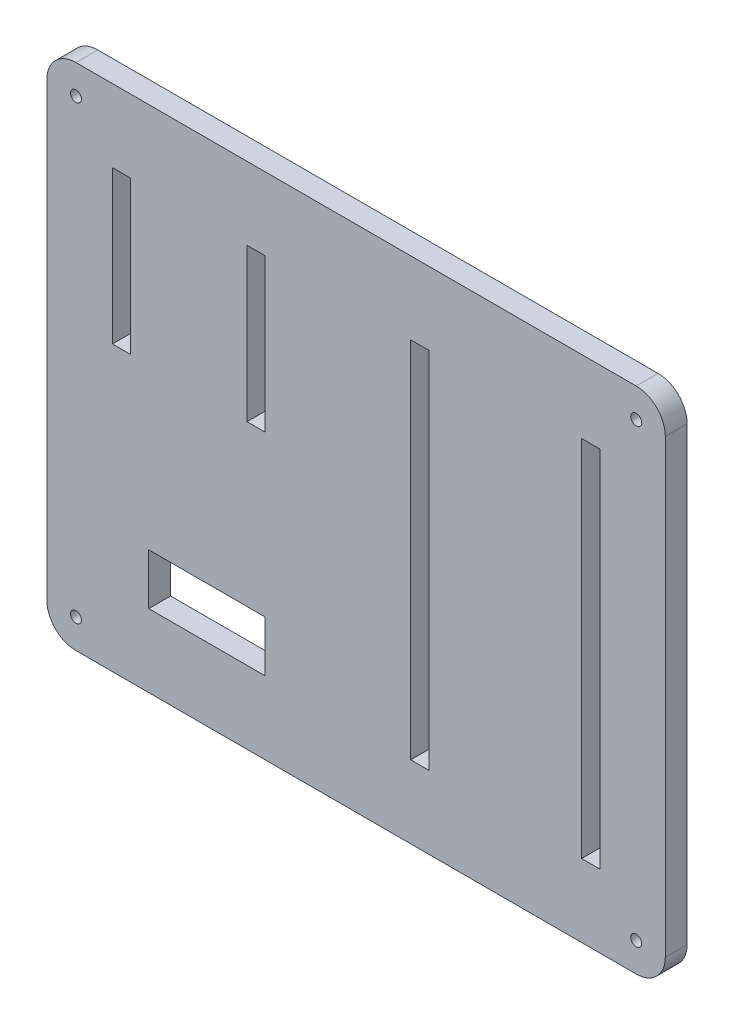
ISO-10303-21;
HEADER;
FILE_DESCRIPTION(('STEP AP214'),'2;1');
FILE_NAME('part.step','',(''),(''),'','','');
FILE_SCHEMA(('AUTOMOTIVE_DESIGN { 1 0 10303 214 1 1 1 1 }'));
ENDSEC;
DATA;
#1=APPLICATION_CONTEXT('core data for automotive mechanical design processes');
#2=APPLICATION_PROTOCOL_DEFINITION('international standard','automotive_design',2000,#1);
#3=PRODUCT_CONTEXT('',#1,'mechanical');
#4=PRODUCT('Part','Part','',(#3));
#5=PRODUCT_RELATED_PRODUCT_CATEGORY('part','',(#4));
#6=PRODUCT_DEFINITION_FORMATION('','',#4);
#7=PRODUCT_DEFINITION_CONTEXT('part definition',#1,'design');
#8=PRODUCT_DEFINITION('design','',#6,#7);
#9=PRODUCT_DEFINITION_SHAPE('','',#8);
#10=(LENGTH_UNIT() NAMED_UNIT(*) SI_UNIT(.MILLI.,.METRE.));
#11=(NAMED_UNIT(*) PLANE_ANGLE_UNIT() SI_UNIT($,.RADIAN.));
#12=(NAMED_UNIT(*) SI_UNIT($,.STERADIAN.) SOLID_ANGLE_UNIT());
#13=UNCERTAINTY_MEASURE_WITH_UNIT(LENGTH_MEASURE(1.E-05),#10,'distance_accuracy_value','');
#14=(GEOMETRIC_REPRESENTATION_CONTEXT(3) GLOBAL_UNCERTAINTY_ASSIGNED_CONTEXT((#13)) GLOBAL_UNIT_ASSIGNED_CONTEXT((#10,
#11,#12)) REPRESENTATION_CONTEXT('',''));
#15=CARTESIAN_POINT('',(0.,0.,0.));
#16=DIRECTION('',(0.,0.,1.));
#17=DIRECTION('',(1.,0.,0.));
#18=AXIS2_PLACEMENT_3D('',#15,#16,#17);
#19=CARTESIAN_POINT('',(0.,0.,3.));
#20=DIRECTION('',(0.,0.,1.));
#21=DIRECTION('',(1.,0.,0.));
#22=AXIS2_PLACEMENT_3D('',#19,#20,#21);
#23=PLANE('',#22);
#24=CARTESIAN_POINT('',(-38.5,31.,3.));
#25=DIRECTION('',(0.,0.,1.));
#26=DIRECTION('',(1.,0.,0.));
#27=AXIS2_PLACEMENT_3D('',#24,#25,#26);
#28=CIRCLE('',#27,0.75);
#29=CARTESIAN_POINT('',(-37.75,31.,3.));
#30=VERTEX_POINT('',#29);
#31=EDGE_CURVE('E766',#30,#30,#28,.F.);
#32=ORIENTED_EDGE('',*,*,#31,.T.);
#33=EDGE_LOOP('',(#32));
#34=FACE_BOUND('',#33,.T.);
#35=CARTESIAN_POINT('',(38.5,31.,3.));
#36=DIRECTION('',(0.,0.,1.));
#37=DIRECTION('',(1.,0.,0.));
#38=AXIS2_PLACEMENT_3D('',#35,#36,#37);
#39=CIRCLE('',#38,0.749999999999999);
#40=CARTESIAN_POINT('',(39.25,31.,3.));
#41=VERTEX_POINT('',#40);
#42=EDGE_CURVE('E763',#41,#41,#39,.T.);
#43=ORIENTED_EDGE('',*,*,#42,.F.);
#44=EDGE_LOOP('',(#43));
#45=FACE_BOUND('',#44,.T.);
#46=DIRECTION('',(0.,-1.,0.));
#47=VECTOR('',#46,1.);
#48=CARTESIAN_POINT('',(-12.5,0.,3.));
#49=LINE('',#48,#47);
#50=CARTESIAN_POINT('',(-12.5,-18.,3.));
#51=VERTEX_POINT('',#50);
#52=CARTESIAN_POINT('',(-12.5,-25.,3.));
#53=VERTEX_POINT('',#52);
#54=EDGE_CURVE('E301',#51,#53,#49,.T.);
#55=ORIENTED_EDGE('',*,*,#54,.T.);
#56=DIRECTION('',(-1.,0.,0.));
#57=VECTOR('',#56,1.);
#58=CARTESIAN_POINT('',(0.,-25.,3.));
#59=LINE('',#58,#57);
#60=CARTESIAN_POINT('',(-28.5,-25.,3.));
#61=VERTEX_POINT('',#60);
#62=EDGE_CURVE('E304',#53,#61,#59,.T.);
#63=ORIENTED_EDGE('',*,*,#62,.T.);
#64=DIRECTION('',(0.,-1.,0.));
#65=VECTOR('',#64,1.);
#66=CARTESIAN_POINT('',(-28.5,0.,3.));
#67=LINE('',#66,#65);
#68=CARTESIAN_POINT('',(-28.5,-18.,3.));
#69=VERTEX_POINT('',#68);
#70=EDGE_CURVE('E308',#69,#61,#67,.T.);
#71=ORIENTED_EDGE('',*,*,#70,.F.);
#72=DIRECTION('',(-1.,0.,0.));
#73=VECTOR('',#72,1.);
#74=CARTESIAN_POINT('',(0.,-18.,3.));
#75=LINE('',#74,#73);
#76=EDGE_CURVE('E311',#51,#69,#75,.T.);
#77=ORIENTED_EDGE('',*,*,#76,.F.);
#78=EDGE_LOOP('',(#55,#63,#71,#77));
#79=FACE_BOUND('',#78,.T.);
#80=DIRECTION('',(0.,1.,0.));
#81=VECTOR('',#80,1.);
#82=CARTESIAN_POINT('',(42.5,35.,3.));
#83=LINE('',#82,#81);
#84=CARTESIAN_POINT('',(42.5,-31.,3.));
#85=VERTEX_POINT('',#84);
#86=CARTESIAN_POINT('',(42.5,31.,3.));
#87=VERTEX_POINT('',#86);
#88=EDGE_CURVE('E392',#85,#87,#83,.T.);
#89=ORIENTED_EDGE('',*,*,#88,.T.);
#90=CARTESIAN_POINT('',(38.5,31.,3.));
#91=DIRECTION('',(0.,0.,1.));
#92=DIRECTION('',(1.,0.,0.));
#93=AXIS2_PLACEMENT_3D('',#90,#91,#92);
#94=CIRCLE('',#93,4.);
#95=CARTESIAN_POINT('',(38.5,35.,3.));
#96=VERTEX_POINT('',#95);
#97=EDGE_CURVE('E435',#87,#96,#94,.T.);
#98=ORIENTED_EDGE('',*,*,#97,.T.);
#99=DIRECTION('',(-1.,0.,0.));
#100=VECTOR('',#99,1.);
#101=CARTESIAN_POINT('',(-42.5,35.,3.));
#102=LINE('',#101,#100);
#103=CARTESIAN_POINT('',(-38.5,35.,3.));
#104=VERTEX_POINT('',#103);
#105=EDGE_CURVE('E395',#96,#104,#102,.T.);
#106=ORIENTED_EDGE('',*,*,#105,.T.);
#107=CARTESIAN_POINT('',(-38.5,31.,3.));
#108=DIRECTION('',(0.,0.,1.));
#109=DIRECTION('',(1.,0.,0.));
#110=AXIS2_PLACEMENT_3D('',#107,#108,#109);
#111=CIRCLE('',#110,4.);
#112=CARTESIAN_POINT('',(-42.5,31.,3.));
#113=VERTEX_POINT('',#112);
#114=EDGE_CURVE('E433',#104,#113,#111,.T.);
#115=ORIENTED_EDGE('',*,*,#114,.T.);
#116=DIRECTION('',(0.,-1.,0.));
#117=VECTOR('',#116,1.);
#118=CARTESIAN_POINT('',(-42.5,35.,3.));
#119=LINE('',#118,#117);
#120=CARTESIAN_POINT('',(-42.5,-31.,3.));
#121=VERTEX_POINT('',#120);
#122=EDGE_CURVE('E399',#113,#121,#119,.T.);
#123=ORIENTED_EDGE('',*,*,#122,.T.);
#124=CARTESIAN_POINT('',(-38.5,-31.,3.));
#125=DIRECTION('',(0.,0.,1.));
#126=DIRECTION('',(1.,0.,0.));
#127=AXIS2_PLACEMENT_3D('',#124,#125,#126);
#128=CIRCLE('',#127,4.);
#129=CARTESIAN_POINT('',(-38.5,-35.,3.));
#130=VERTEX_POINT('',#129);
#131=EDGE_CURVE('E55',#121,#130,#128,.T.);
#132=ORIENTED_EDGE('',*,*,#131,.T.);
#133=DIRECTION('',(1.,0.,0.));
#134=VECTOR('',#133,1.);
#135=CARTESIAN_POINT('',(-42.5,-35.,3.));
#136=LINE('',#135,#134);
#137=CARTESIAN_POINT('',(38.5,-35.,3.));
#138=VERTEX_POINT('',#137);
#139=EDGE_CURVE('E401',#130,#138,#136,.T.);
#140=ORIENTED_EDGE('',*,*,#139,.T.);
#141=CARTESIAN_POINT('',(38.5,-31.,3.));
#142=DIRECTION('',(0.,0.,1.));
#143=DIRECTION('',(1.,0.,0.));
#144=AXIS2_PLACEMENT_3D('',#141,#142,#143);
#145=CIRCLE('',#144,4.);
#146=EDGE_CURVE('E430',#138,#85,#145,.T.);
#147=ORIENTED_EDGE('',*,*,#146,.T.);
#148=EDGE_LOOP('',(#89,#98,#106,#115,#123,#132,#140,#147));
#149=FACE_BOUND('',#148,.T.);
#150=DIRECTION('',(0.,-1.,0.));
#151=VECTOR('',#150,1.);
#152=CARTESIAN_POINT('',(7.50000000000001,0.,3.));
#153=LINE('',#152,#151);
#154=CARTESIAN_POINT('',(7.50000000000001,25.,3.));
#155=VERTEX_POINT('',#154);
#156=CARTESIAN_POINT('',(7.5,-25.,3.));
#157=VERTEX_POINT('',#156);
#158=EDGE_CURVE('E340',#155,#157,#153,.T.);
#159=ORIENTED_EDGE('',*,*,#158,.F.);
#160=DIRECTION('',(-1.,0.,0.));
#161=VECTOR('',#160,1.);
#162=CARTESIAN_POINT('',(0.,25.,3.));
#163=LINE('',#162,#161);
#164=CARTESIAN_POINT('',(10.,25.,3.));
#165=VERTEX_POINT('',#164);
#166=EDGE_CURVE('E331',#165,#155,#163,.T.);
#167=ORIENTED_EDGE('',*,*,#166,.F.);
#168=DIRECTION('',(0.,-1.,0.));
#169=VECTOR('',#168,1.);
#170=CARTESIAN_POINT('',(10.,0.,3.));
#171=LINE('',#170,#169);
#172=CARTESIAN_POINT('',(10.,-25.,3.));
#173=VERTEX_POINT('',#172);
#174=EDGE_CURVE('E333',#165,#173,#171,.T.);
#175=ORIENTED_EDGE('',*,*,#174,.T.);
#176=DIRECTION('',(-1.,0.,0.));
#177=VECTOR('',#176,1.);
#178=CARTESIAN_POINT('',(0.,-25.,3.));
#179=LINE('',#178,#177);
#180=EDGE_CURVE('E337',#173,#157,#179,.T.);
#181=ORIENTED_EDGE('',*,*,#180,.T.);
#182=EDGE_LOOP('',(#159,#167,#175,#181));
#183=FACE_BOUND('',#182,.T.);
#184=DIRECTION('',(-1.,0.,0.));
#185=VECTOR('',#184,1.);
#186=CARTESIAN_POINT('',(0.,4.,3.));
#187=LINE('',#186,#185);
#188=CARTESIAN_POINT('',(-12.5,4.,3.));
#189=VERTEX_POINT('',#188);
#190=CARTESIAN_POINT('',(-15.,4.,3.));
#191=VERTEX_POINT('',#190);
#192=EDGE_CURVE('E371',#189,#191,#187,.T.);
#193=ORIENTED_EDGE('',*,*,#192,.T.);
#194=DIRECTION('',(0.,-1.,0.));
#195=VECTOR('',#194,1.);
#196=CARTESIAN_POINT('',(-15.,0.,3.));
#197=LINE('',#196,#195);
#198=CARTESIAN_POINT('',(-15.,25.,3.));
#199=VERTEX_POINT('',#198);
#200=EDGE_CURVE('E363',#199,#191,#197,.T.);
#201=ORIENTED_EDGE('',*,*,#200,.F.);
#202=DIRECTION('',(-1.,0.,0.));
#203=VECTOR('',#202,1.);
#204=CARTESIAN_POINT('',(0.,25.,3.));
#205=LINE('',#204,#203);
#206=CARTESIAN_POINT('',(-12.5,25.,3.));
#207=VERTEX_POINT('',#206);
#208=EDGE_CURVE('E365',#207,#199,#205,.T.);
#209=ORIENTED_EDGE('',*,*,#208,.F.);
#210=DIRECTION('',(0.,-1.,0.));
#211=VECTOR('',#210,1.);
#212=CARTESIAN_POINT('',(-12.5,0.,3.));
#213=LINE('',#212,#211);
#214=EDGE_CURVE('E368',#207,#189,#213,.T.);
#215=ORIENTED_EDGE('',*,*,#214,.T.);
#216=EDGE_LOOP('',(#193,#201,#209,#215));
#217=FACE_BOUND('',#216,.T.);
#218=DIRECTION('',(0.,-1.,0.));
#219=VECTOR('',#218,1.);
#220=CARTESIAN_POINT('',(-33.5,0.,3.));
#221=LINE('',#220,#219);
#222=CARTESIAN_POINT('',(-33.5,25.,3.));
#223=VERTEX_POINT('',#222);
#224=CARTESIAN_POINT('',(-33.5,4.00000000000001,3.));
#225=VERTEX_POINT('',#224);
#226=EDGE_CURVE('E276',#223,#225,#221,.T.);
#227=ORIENTED_EDGE('',*,*,#226,.F.);
#228=DIRECTION('',(-1.,0.,0.));
#229=VECTOR('',#228,1.);
#230=CARTESIAN_POINT('',(0.,25.,3.));
#231=LINE('',#230,#229);
#232=CARTESIAN_POINT('',(-31.,25.,3.));
#233=VERTEX_POINT('',#232);
#234=EDGE_CURVE('E267',#233,#223,#231,.T.);
#235=ORIENTED_EDGE('',*,*,#234,.F.);
#236=DIRECTION('',(0.,-1.,0.));
#237=VECTOR('',#236,1.);
#238=CARTESIAN_POINT('',(-31.,0.,3.));
#239=LINE('',#238,#237);
#240=CARTESIAN_POINT('',(-31.,4.00000000000001,3.));
#241=VERTEX_POINT('',#240);
#242=EDGE_CURVE('E269',#233,#241,#239,.T.);
#243=ORIENTED_EDGE('',*,*,#242,.T.);
#244=DIRECTION('',(-1.,0.,0.));
#245=VECTOR('',#244,1.);
#246=CARTESIAN_POINT('',(0.,4.,3.));
#247=LINE('',#246,#245);
#248=EDGE_CURVE('E273',#241,#225,#247,.T.);
#249=ORIENTED_EDGE('',*,*,#248,.T.);
#250=EDGE_LOOP('',(#227,#235,#243,#249));
#251=FACE_BOUND('',#250,.T.);
#252=DIRECTION('',(-1.,0.,0.));
#253=VECTOR('',#252,1.);
#254=CARTESIAN_POINT('',(0.,-25.,3.));
#255=LINE('',#254,#253);
#256=CARTESIAN_POINT('',(33.5,-25.,3.));
#257=VERTEX_POINT('',#256);
#258=CARTESIAN_POINT('',(31.,-25.,3.));
#259=VERTEX_POINT('',#258);
#260=EDGE_CURVE('E239',#257,#259,#255,.T.);
#261=ORIENTED_EDGE('',*,*,#260,.T.);
#262=DIRECTION('',(0.,-1.,0.));
#263=VECTOR('',#262,1.);
#264=CARTESIAN_POINT('',(31.,0.,3.));
#265=LINE('',#264,#263);
#266=CARTESIAN_POINT('',(31.,25.,3.));
#267=VERTEX_POINT('',#266);
#268=EDGE_CURVE('E232',#267,#259,#265,.T.);
#269=ORIENTED_EDGE('',*,*,#268,.F.);
#270=DIRECTION('',(-1.,0.,0.));
#271=VECTOR('',#270,1.);
#272=CARTESIAN_POINT('',(0.,25.,3.));
#273=LINE('',#272,#271);
#274=CARTESIAN_POINT('',(33.5,25.,3.));
#275=VERTEX_POINT('',#274);
#276=EDGE_CURVE('E221',#275,#267,#273,.T.);
#277=ORIENTED_EDGE('',*,*,#276,.F.);
#278=DIRECTION('',(0.,-1.,0.));
#279=VECTOR('',#278,1.);
#280=CARTESIAN_POINT('',(33.5,0.,3.));
#281=LINE('',#280,#279);
#282=EDGE_CURVE('E231',#275,#257,#281,.T.);
#283=ORIENTED_EDGE('',*,*,#282,.T.);
#284=EDGE_LOOP('',(#261,#269,#277,#283));
#285=FACE_BOUND('',#284,.T.);
#286=CARTESIAN_POINT('',(-38.5,-31.,3.));
#287=DIRECTION('',(0.,0.,1.));
#288=DIRECTION('',(1.,0.,0.));
#289=AXIS2_PLACEMENT_3D('',#286,#287,#288);
#290=CIRCLE('',#289,0.75);
#291=CARTESIAN_POINT('',(-37.75,-31.,3.));
#292=VERTEX_POINT('',#291);
#293=EDGE_CURVE('E767',#292,#292,#290,.T.);
#294=ORIENTED_EDGE('',*,*,#293,.F.);
#295=EDGE_LOOP('',(#294));
#296=FACE_BOUND('',#295,.T.);
#297=CARTESIAN_POINT('',(38.5,-31.,3.));
#298=DIRECTION('',(0.,0.,1.));
#299=DIRECTION('',(1.,0.,0.));
#300=AXIS2_PLACEMENT_3D('',#297,#298,#299);
#301=CIRCLE('',#300,0.749999999999999);
#302=CARTESIAN_POINT('',(39.25,-31.,3.));
#303=VERTEX_POINT('',#302);
#304=EDGE_CURVE('E250',#303,#303,#301,.F.);
#305=ORIENTED_EDGE('',*,*,#304,.T.);
#306=EDGE_LOOP('',(#305));
#307=FACE_BOUND('',#306,.T.);
#308=ADVANCED_FACE('F34',(#34,#45,#79,#149,#183,#217,#251,#285,#296,#307),#23,.T.);
#309=CARTESIAN_POINT('',(0.,0.,0.));
#310=DIRECTION('',(0.,0.,1.));
#311=DIRECTION('',(1.,0.,0.));
#312=AXIS2_PLACEMENT_3D('',#309,#310,#311);
#313=PLANE('',#312);
#314=CARTESIAN_POINT('',(-38.5,-31.,0.));
#315=DIRECTION('',(0.,0.,-1.));
#316=DIRECTION('',(-1.,0.,0.));
#317=AXIS2_PLACEMENT_3D('',#314,#315,#316);
#318=CIRCLE('',#317,0.75);
#319=CARTESIAN_POINT('',(-39.25,-31.,0.));
#320=VERTEX_POINT('',#319);
#321=EDGE_CURVE('E753',#320,#320,#318,.T.);
#322=ORIENTED_EDGE('',*,*,#321,.F.);
#323=EDGE_LOOP('',(#322));
#324=FACE_BOUND('',#323,.T.);
#325=CARTESIAN_POINT('',(38.5,31.,0.));
#326=DIRECTION('',(0.,0.,-1.));
#327=DIRECTION('',(-1.,0.,0.));
#328=AXIS2_PLACEMENT_3D('',#325,#326,#327);
#329=CIRCLE('',#328,0.749999999999999);
#330=CARTESIAN_POINT('',(37.75,31.,0.));
#331=VERTEX_POINT('',#330);
#332=EDGE_CURVE('E760',#331,#331,#329,.T.);
#333=ORIENTED_EDGE('',*,*,#332,.F.);
#334=EDGE_LOOP('',(#333));
#335=FACE_BOUND('',#334,.T.);
#336=DIRECTION('',(-1.,0.,0.));
#337=VECTOR('',#336,1.);
#338=CARTESIAN_POINT('',(0.,25.,0.));
#339=LINE('',#338,#337);
#340=CARTESIAN_POINT('',(-31.,25.,0.));
#341=VERTEX_POINT('',#340);
#342=CARTESIAN_POINT('',(-33.5,25.,0.));
#343=VERTEX_POINT('',#342);
#344=EDGE_CURVE('E279',#341,#343,#339,.T.);
#345=ORIENTED_EDGE('',*,*,#344,.T.);
#346=DIRECTION('',(0.,-1.,0.));
#347=VECTOR('',#346,1.);
#348=CARTESIAN_POINT('',(-33.5,0.,0.));
#349=LINE('',#348,#347);
#350=CARTESIAN_POINT('',(-33.5,4.00000000000001,0.));
#351=VERTEX_POINT('',#350);
#352=EDGE_CURVE('E270',#343,#351,#349,.T.);
#353=ORIENTED_EDGE('',*,*,#352,.T.);
#354=DIRECTION('',(-1.,0.,0.));
#355=VECTOR('',#354,1.);
#356=CARTESIAN_POINT('',(0.,4.,0.));
#357=LINE('',#356,#355);
#358=CARTESIAN_POINT('',(-31.,4.00000000000001,0.));
#359=VERTEX_POINT('',#358);
#360=EDGE_CURVE('E286',#359,#351,#357,.T.);
#361=ORIENTED_EDGE('',*,*,#360,.F.);
#362=DIRECTION('',(0.,-1.,0.));
#363=VECTOR('',#362,1.);
#364=CARTESIAN_POINT('',(-31.,0.,0.));
#365=LINE('',#364,#363);
#366=EDGE_CURVE('E282',#341,#359,#365,.T.);
#367=ORIENTED_EDGE('',*,*,#366,.F.);
#368=EDGE_LOOP('',(#345,#353,#361,#367));
#369=FACE_BOUND('',#368,.T.);
#370=DIRECTION('',(-1.,0.,0.));
#371=VECTOR('',#370,1.);
#372=CARTESIAN_POINT('',(0.,25.,0.));
#373=LINE('',#372,#371);
#374=CARTESIAN_POINT('',(10.,25.,0.));
#375=VERTEX_POINT('',#374);
#376=CARTESIAN_POINT('',(7.50000000000001,25.,0.));
#377=VERTEX_POINT('',#376);
#378=EDGE_CURVE('E343',#375,#377,#373,.T.);
#379=ORIENTED_EDGE('',*,*,#378,.T.);
#380=DIRECTION('',(0.,-1.,0.));
#381=VECTOR('',#380,1.);
#382=CARTESIAN_POINT('',(7.50000000000001,0.,0.));
#383=LINE('',#382,#381);
#384=CARTESIAN_POINT('',(7.5,-25.,0.));
#385=VERTEX_POINT('',#384);
#386=EDGE_CURVE('E334',#377,#385,#383,.T.);
#387=ORIENTED_EDGE('',*,*,#386,.T.);
#388=DIRECTION('',(-1.,0.,0.));
#389=VECTOR('',#388,1.);
#390=CARTESIAN_POINT('',(0.,-25.,0.));
#391=LINE('',#390,#389);
#392=CARTESIAN_POINT('',(10.,-25.,0.));
#393=VERTEX_POINT('',#392);
#394=EDGE_CURVE('E350',#393,#385,#391,.T.);
#395=ORIENTED_EDGE('',*,*,#394,.F.);
#396=DIRECTION('',(0.,-1.,0.));
#397=VECTOR('',#396,1.);
#398=CARTESIAN_POINT('',(10.,0.,0.));
#399=LINE('',#398,#397);
#400=EDGE_CURVE('E346',#375,#393,#399,.T.);
#401=ORIENTED_EDGE('',*,*,#400,.F.);
#402=EDGE_LOOP('',(#379,#387,#395,#401));
#403=FACE_BOUND('',#402,.T.);
#404=DIRECTION('',(-1.,0.,0.));
#405=VECTOR('',#404,1.);
#406=CARTESIAN_POINT('',(-42.5,35.,0.));
#407=LINE('',#406,#405);
#408=CARTESIAN_POINT('',(38.5,35.,0.));
#409=VERTEX_POINT('',#408);
#410=CARTESIAN_POINT('',(-38.5,35.,0.));
#411=VERTEX_POINT('',#410);
#412=EDGE_CURVE('E406',#409,#411,#407,.T.);
#413=ORIENTED_EDGE('',*,*,#412,.F.);
#414=CARTESIAN_POINT('',(38.5,31.,0.));
#415=DIRECTION('',(0.,0.,1.));
#416=DIRECTION('',(1.,0.,0.));
#417=AXIS2_PLACEMENT_3D('',#414,#415,#416);
#418=CIRCLE('',#417,4.);
#419=CARTESIAN_POINT('',(42.5,31.,0.));
#420=VERTEX_POINT('',#419);
#421=EDGE_CURVE('E423',#409,#420,#418,.F.);
#422=ORIENTED_EDGE('',*,*,#421,.T.);
#423=DIRECTION('',(0.,1.,0.));
#424=VECTOR('',#423,1.);
#425=CARTESIAN_POINT('',(42.5,35.,0.));
#426=LINE('',#425,#424);
#427=CARTESIAN_POINT('',(42.5,-31.,0.));
#428=VERTEX_POINT('',#427);
#429=EDGE_CURVE('E263',#428,#420,#426,.T.);
#430=ORIENTED_EDGE('',*,*,#429,.F.);
#431=CARTESIAN_POINT('',(38.5,-31.,0.));
#432=DIRECTION('',(0.,0.,1.));
#433=DIRECTION('',(1.,0.,0.));
#434=AXIS2_PLACEMENT_3D('',#431,#432,#433);
#435=CIRCLE('',#434,4.);
#436=CARTESIAN_POINT('',(38.5,-35.,0.));
#437=VERTEX_POINT('',#436);
#438=EDGE_CURVE('E417',#428,#437,#435,.F.);
#439=ORIENTED_EDGE('',*,*,#438,.T.);
#440=DIRECTION('',(1.,0.,0.));
#441=VECTOR('',#440,1.);
#442=CARTESIAN_POINT('',(-42.5,-35.,0.));
#443=LINE('',#442,#441);
#444=CARTESIAN_POINT('',(-38.5,-35.,0.));
#445=VERTEX_POINT('',#444);
#446=EDGE_CURVE('E396',#445,#437,#443,.T.);
#447=ORIENTED_EDGE('',*,*,#446,.F.);
#448=CARTESIAN_POINT('',(-38.5,-31.,0.));
#449=DIRECTION('',(0.,0.,1.));
#450=DIRECTION('',(1.,0.,0.));
#451=AXIS2_PLACEMENT_3D('',#448,#449,#450);
#452=CIRCLE('',#451,4.);
#453=CARTESIAN_POINT('',(-42.5,-31.,0.));
#454=VERTEX_POINT('',#453);
#455=EDGE_CURVE('E419',#445,#454,#452,.F.);
#456=ORIENTED_EDGE('',*,*,#455,.T.);
#457=DIRECTION('',(0.,-1.,0.));
#458=VECTOR('',#457,1.);
#459=CARTESIAN_POINT('',(-42.5,35.,0.));
#460=LINE('',#459,#458);
#461=CARTESIAN_POINT('',(-42.5,31.,0.));
#462=VERTEX_POINT('',#461);
#463=EDGE_CURVE('E409',#462,#454,#460,.T.);
#464=ORIENTED_EDGE('',*,*,#463,.F.);
#465=CARTESIAN_POINT('',(-38.5,31.,0.));
#466=DIRECTION('',(0.,0.,1.));
#467=DIRECTION('',(1.,0.,0.));
#468=AXIS2_PLACEMENT_3D('',#465,#466,#467);
#469=CIRCLE('',#468,4.);
#470=EDGE_CURVE('E421',#462,#411,#469,.F.);
#471=ORIENTED_EDGE('',*,*,#470,.T.);
#472=EDGE_LOOP('',(#413,#422,#430,#439,#447,#456,#464,#471));
#473=FACE_BOUND('',#472,.T.);
#474=DIRECTION('',(0.,-1.,0.));
#475=VECTOR('',#474,1.);
#476=CARTESIAN_POINT('',(-15.,0.,0.));
#477=LINE('',#476,#475);
#478=CARTESIAN_POINT('',(-15.,25.,0.));
#479=VERTEX_POINT('',#478);
#480=CARTESIAN_POINT('',(-15.,4.,0.));
#481=VERTEX_POINT('',#480);
#482=EDGE_CURVE('E294',#479,#481,#477,.T.);
#483=ORIENTED_EDGE('',*,*,#482,.T.);
#484=DIRECTION('',(-1.,0.,0.));
#485=VECTOR('',#484,1.);
#486=CARTESIAN_POINT('',(0.,4.,0.));
#487=LINE('',#486,#485);
#488=CARTESIAN_POINT('',(-12.5,4.,0.));
#489=VERTEX_POINT('',#488);
#490=EDGE_CURVE('E366',#489,#481,#487,.T.);
#491=ORIENTED_EDGE('',*,*,#490,.F.);
#492=DIRECTION('',(0.,-1.,0.));
#493=VECTOR('',#492,1.);
#494=CARTESIAN_POINT('',(-12.5,0.,0.));
#495=LINE('',#494,#493);
#496=CARTESIAN_POINT('',(-12.5,25.,0.));
#497=VERTEX_POINT('',#496);
#498=EDGE_CURVE('E380',#497,#489,#495,.T.);
#499=ORIENTED_EDGE('',*,*,#498,.F.);
#500=DIRECTION('',(-1.,0.,0.));
#501=VECTOR('',#500,1.);
#502=CARTESIAN_POINT('',(0.,25.,0.));
#503=LINE('',#502,#501);
#504=EDGE_CURVE('E377',#497,#479,#503,.T.);
#505=ORIENTED_EDGE('',*,*,#504,.T.);
#506=EDGE_LOOP('',(#483,#491,#499,#505));
#507=FACE_BOUND('',#506,.T.);
#508=DIRECTION('',(-1.,0.,0.));
#509=VECTOR('',#508,1.);
#510=CARTESIAN_POINT('',(0.,-25.,0.));
#511=LINE('',#510,#509);
#512=CARTESIAN_POINT('',(-12.5,-25.,0.));
#513=VERTEX_POINT('',#512);
#514=CARTESIAN_POINT('',(-28.5,-25.,0.));
#515=VERTEX_POINT('',#514);
#516=EDGE_CURVE('E316',#513,#515,#511,.T.);
#517=ORIENTED_EDGE('',*,*,#516,.F.);
#518=DIRECTION('',(0.,-1.,0.));
#519=VECTOR('',#518,1.);
#520=CARTESIAN_POINT('',(-12.5,0.,0.));
#521=LINE('',#520,#519);
#522=CARTESIAN_POINT('',(-12.5,-18.,0.));
#523=VERTEX_POINT('',#522);
#524=EDGE_CURVE('E314',#523,#513,#521,.T.);
#525=ORIENTED_EDGE('',*,*,#524,.F.);
#526=DIRECTION('',(-1.,0.,0.));
#527=VECTOR('',#526,1.);
#528=CARTESIAN_POINT('',(0.,-18.,0.));
#529=LINE('',#528,#527);
#530=CARTESIAN_POINT('',(-28.5,-18.,0.));
#531=VERTEX_POINT('',#530);
#532=EDGE_CURVE('E305',#523,#531,#529,.T.);
#533=ORIENTED_EDGE('',*,*,#532,.T.);
#534=DIRECTION('',(0.,-1.,0.));
#535=VECTOR('',#534,1.);
#536=CARTESIAN_POINT('',(-28.5,0.,0.));
#537=LINE('',#536,#535);
#538=EDGE_CURVE('E319',#531,#515,#537,.T.);
#539=ORIENTED_EDGE('',*,*,#538,.T.);
#540=EDGE_LOOP('',(#517,#525,#533,#539));
#541=FACE_BOUND('',#540,.T.);
#542=DIRECTION('',(0.,-1.,0.));
#543=VECTOR('',#542,1.);
#544=CARTESIAN_POINT('',(31.,0.,0.));
#545=LINE('',#544,#543);
#546=CARTESIAN_POINT('',(31.,25.,0.));
#547=VERTEX_POINT('',#546);
#548=CARTESIAN_POINT('',(31.,-25.,0.));
#549=VERTEX_POINT('',#548);
#550=EDGE_CURVE('E238',#547,#549,#545,.T.);
#551=ORIENTED_EDGE('',*,*,#550,.T.);
#552=DIRECTION('',(-1.,0.,0.));
#553=VECTOR('',#552,1.);
#554=CARTESIAN_POINT('',(0.,-25.,0.));
#555=LINE('',#554,#553);
#556=CARTESIAN_POINT('',(33.5,-25.,0.));
#557=VERTEX_POINT('',#556);
#558=EDGE_CURVE('E244',#557,#549,#555,.T.);
#559=ORIENTED_EDGE('',*,*,#558,.F.);
#560=DIRECTION('',(0.,-1.,0.));
#561=VECTOR('',#560,1.);
#562=CARTESIAN_POINT('',(33.5,0.,0.));
#563=LINE('',#562,#561);
#564=CARTESIAN_POINT('',(33.5,25.,0.));
#565=VERTEX_POINT('',#564);
#566=EDGE_CURVE('E247',#565,#557,#563,.T.);
#567=ORIENTED_EDGE('',*,*,#566,.F.);
#568=DIRECTION('',(-1.,0.,0.));
#569=VECTOR('',#568,1.);
#570=CARTESIAN_POINT('',(0.,25.,0.));
#571=LINE('',#570,#569);
#572=EDGE_CURVE('E256',#565,#547,#571,.T.);
#573=ORIENTED_EDGE('',*,*,#572,.T.);
#574=EDGE_LOOP('',(#551,#559,#567,#573));
#575=FACE_BOUND('',#574,.T.);
#576=CARTESIAN_POINT('',(-38.5,31.,0.));
#577=DIRECTION('',(0.,0.,1.));
#578=DIRECTION('',(1.,0.,0.));
#579=AXIS2_PLACEMENT_3D('',#576,#577,#578);
#580=CIRCLE('',#579,0.75);
#581=CARTESIAN_POINT('',(-37.75,31.,0.));
#582=VERTEX_POINT('',#581);
#583=EDGE_CURVE('E756',#582,#582,#580,.T.);
#584=ORIENTED_EDGE('',*,*,#583,.T.);
#585=EDGE_LOOP('',(#584));
#586=FACE_BOUND('',#585,.T.);
#587=CARTESIAN_POINT('',(38.5,-31.,0.));
#588=DIRECTION('',(0.,0.,1.));
#589=DIRECTION('',(1.,0.,0.));
#590=AXIS2_PLACEMENT_3D('',#587,#588,#589);
#591=CIRCLE('',#590,0.749999999999999);
#592=CARTESIAN_POINT('',(39.25,-31.,0.));
#593=VERTEX_POINT('',#592);
#594=EDGE_CURVE('E751',#593,#593,#591,.T.);
#595=ORIENTED_EDGE('',*,*,#594,.T.);
#596=EDGE_LOOP('',(#595));
#597=FACE_BOUND('',#596,.T.);
#598=ADVANCED_FACE('F451',(#324,#335,#369,#403,#473,#507,#541,#575,#586,#597),#313,.F.);
#599=CARTESIAN_POINT('',(42.5,35.,3.));
#600=DIRECTION('',(-1.,0.,0.));
#601=DIRECTION('',(0.,-1.,0.));
#602=AXIS2_PLACEMENT_3D('',#599,#600,#601);
#603=PLANE('',#602);
#604=ORIENTED_EDGE('',*,*,#429,.T.);
#605=DIRECTION('',(0.,0.,-1.));
#606=VECTOR('',#605,1.);
#607=CARTESIAN_POINT('',(42.5,31.,3.));
#608=LINE('',#607,#606);
#609=EDGE_CURVE('E428',#420,#87,#608,.F.);
#610=ORIENTED_EDGE('',*,*,#609,.T.);
#611=ORIENTED_EDGE('',*,*,#88,.F.);
#612=DIRECTION('',(0.,0.,-1.));
#613=VECTOR('',#612,1.);
#614=CARTESIAN_POINT('',(42.5,-31.,3.));
#615=LINE('',#614,#613);
#616=EDGE_CURVE('E425',#85,#428,#615,.T.);
#617=ORIENTED_EDGE('',*,*,#616,.T.);
#618=EDGE_LOOP('',(#604,#610,#611,#617));
#619=FACE_BOUND('',#618,.T.);
#620=ADVANCED_FACE('F465',(#619),#603,.F.);
#621=CARTESIAN_POINT('',(-42.5,35.,3.));
#622=DIRECTION('',(0.,-1.,0.));
#623=DIRECTION('',(0.,0.,-1.));
#624=AXIS2_PLACEMENT_3D('',#621,#622,#623);
#625=PLANE('',#624);
#626=ORIENTED_EDGE('',*,*,#105,.F.);
#627=DIRECTION('',(0.,0.,-1.));
#628=VECTOR('',#627,1.);
#629=CARTESIAN_POINT('',(38.5,35.,3.));
#630=LINE('',#629,#628);
#631=EDGE_CURVE('E414',#96,#409,#630,.T.);
#632=ORIENTED_EDGE('',*,*,#631,.T.);
#633=ORIENTED_EDGE('',*,*,#412,.T.);
#634=DIRECTION('',(0.,0.,-1.));
#635=VECTOR('',#634,1.);
#636=CARTESIAN_POINT('',(-38.5,35.,3.));
#637=LINE('',#636,#635);
#638=EDGE_CURVE('E403',#411,#104,#637,.F.);
#639=ORIENTED_EDGE('',*,*,#638,.T.);
#640=EDGE_LOOP('',(#626,#632,#633,#639));
#641=FACE_BOUND('',#640,.T.);
#642=ADVANCED_FACE('F473',(#641),#625,.F.);
#643=CARTESIAN_POINT('',(-42.5,35.,3.));
#644=DIRECTION('',(1.,0.,0.));
#645=DIRECTION('',(0.,1.,0.));
#646=AXIS2_PLACEMENT_3D('',#643,#644,#645);
#647=PLANE('',#646);
#648=ORIENTED_EDGE('',*,*,#122,.F.);
#649=DIRECTION('',(0.,0.,-1.));
#650=VECTOR('',#649,1.);
#651=CARTESIAN_POINT('',(-42.5,31.,3.));
#652=LINE('',#651,#650);
#653=EDGE_CURVE('E439',#113,#462,#652,.T.);
#654=ORIENTED_EDGE('',*,*,#653,.T.);
#655=ORIENTED_EDGE('',*,*,#463,.T.);
#656=DIRECTION('',(0.,0.,-1.));
#657=VECTOR('',#656,1.);
#658=CARTESIAN_POINT('',(-42.5,-31.,3.));
#659=LINE('',#658,#657);
#660=EDGE_CURVE('E437',#454,#121,#659,.F.);
#661=ORIENTED_EDGE('',*,*,#660,.T.);
#662=EDGE_LOOP('',(#648,#654,#655,#661));
#663=FACE_BOUND('',#662,.T.);
#664=ADVANCED_FACE('F445',(#663),#647,.F.);
#665=CARTESIAN_POINT('',(-42.5,-35.,3.));
#666=DIRECTION('',(0.,1.,0.));
#667=DIRECTION('',(0.,0.,1.));
#668=AXIS2_PLACEMENT_3D('',#665,#666,#667);
#669=PLANE('',#668);
#670=ORIENTED_EDGE('',*,*,#139,.F.);
#671=DIRECTION('',(0.,0.,-1.));
#672=VECTOR('',#671,1.);
#673=CARTESIAN_POINT('',(-38.5,-35.,3.));
#674=LINE('',#673,#672);
#675=EDGE_CURVE('E11',#130,#445,#674,.T.);
#676=ORIENTED_EDGE('',*,*,#675,.T.);
#677=ORIENTED_EDGE('',*,*,#446,.T.);
#678=DIRECTION('',(0.,0.,-1.));
#679=VECTOR('',#678,1.);
#680=CARTESIAN_POINT('',(38.5,-35.,3.));
#681=LINE('',#680,#679);
#682=EDGE_CURVE('E42',#437,#138,#681,.F.);
#683=ORIENTED_EDGE('',*,*,#682,.T.);
#684=EDGE_LOOP('',(#670,#676,#677,#683));
#685=FACE_BOUND('',#684,.T.);
#686=ADVANCED_FACE('F457',(#685),#669,.F.);
#687=CARTESIAN_POINT('',(0.,25.,3.));
#688=DIRECTION('',(0.,-1.,0.));
#689=DIRECTION('',(1.,0.,0.));
#690=AXIS2_PLACEMENT_3D('',#687,#688,#689);
#691=PLANE('',#690);
#692=ORIENTED_EDGE('',*,*,#378,.F.);
#693=DIRECTION('',(0.,0.,-1.));
#694=VECTOR('',#693,1.);
#695=CARTESIAN_POINT('',(10.,25.,3.));
#696=LINE('',#695,#694);
#697=EDGE_CURVE('E342',#165,#375,#696,.T.);
#698=ORIENTED_EDGE('',*,*,#697,.F.);
#699=ORIENTED_EDGE('',*,*,#166,.T.);
#700=DIRECTION('',(0.,0.,-1.));
#701=VECTOR('',#700,1.);
#702=CARTESIAN_POINT('',(7.50000000000001,25.,3.));
#703=LINE('',#702,#701);
#704=EDGE_CURVE('E257',#155,#377,#703,.T.);
#705=ORIENTED_EDGE('',*,*,#704,.T.);
#706=EDGE_LOOP('',(#692,#698,#699,#705));
#707=FACE_BOUND('',#706,.T.);
#708=ADVANCED_FACE('F499',(#707),#691,.T.);
#709=CARTESIAN_POINT('',(7.50000000000001,0.,3.));
#710=DIRECTION('',(1.,0.,0.));
#711=DIRECTION('',(0.,1.,0.));
#712=AXIS2_PLACEMENT_3D('',#709,#710,#711);
#713=PLANE('',#712);
#714=ORIENTED_EDGE('',*,*,#386,.F.);
#715=ORIENTED_EDGE('',*,*,#704,.F.);
#716=ORIENTED_EDGE('',*,*,#158,.T.);
#717=DIRECTION('',(0.,0.,-1.));
#718=VECTOR('',#717,1.);
#719=CARTESIAN_POINT('',(7.5,-25.,3.));
#720=LINE('',#719,#718);
#721=EDGE_CURVE('E357',#157,#385,#720,.T.);
#722=ORIENTED_EDGE('',*,*,#721,.T.);
#723=EDGE_LOOP('',(#714,#715,#716,#722));
#724=FACE_BOUND('',#723,.T.);
#725=ADVANCED_FACE('F529',(#724),#713,.T.);
#726=CARTESIAN_POINT('',(0.,-25.,3.));
#727=DIRECTION('',(0.,-1.,0.));
#728=DIRECTION('',(1.,0.,0.));
#729=AXIS2_PLACEMENT_3D('',#726,#727,#728);
#730=PLANE('',#729);
#731=ORIENTED_EDGE('',*,*,#394,.T.);
#732=ORIENTED_EDGE('',*,*,#721,.F.);
#733=ORIENTED_EDGE('',*,*,#180,.F.);
#734=DIRECTION('',(0.,0.,-1.));
#735=VECTOR('',#734,1.);
#736=CARTESIAN_POINT('',(10.,-25.,3.));
#737=LINE('',#736,#735);
#738=EDGE_CURVE('E359',#173,#393,#737,.T.);
#739=ORIENTED_EDGE('',*,*,#738,.T.);
#740=EDGE_LOOP('',(#731,#732,#733,#739));
#741=FACE_BOUND('',#740,.T.);
#742=ADVANCED_FACE('F537',(#741),#730,.F.);
#743=CARTESIAN_POINT('',(10.,0.,3.));
#744=DIRECTION('',(1.,0.,0.));
#745=DIRECTION('',(0.,1.,0.));
#746=AXIS2_PLACEMENT_3D('',#743,#744,#745);
#747=PLANE('',#746);
#748=ORIENTED_EDGE('',*,*,#400,.T.);
#749=ORIENTED_EDGE('',*,*,#738,.F.);
#750=ORIENTED_EDGE('',*,*,#174,.F.);
#751=ORIENTED_EDGE('',*,*,#697,.T.);
#752=EDGE_LOOP('',(#748,#749,#750,#751));
#753=FACE_BOUND('',#752,.T.);
#754=ADVANCED_FACE('F545',(#753),#747,.F.);
#755=CARTESIAN_POINT('',(-15.,0.,3.));
#756=DIRECTION('',(1.,0.,0.));
#757=DIRECTION('',(0.,1.,0.));
#758=AXIS2_PLACEMENT_3D('',#755,#756,#757);
#759=PLANE('',#758);
#760=ORIENTED_EDGE('',*,*,#482,.F.);
#761=DIRECTION('',(0.,0.,-1.));
#762=VECTOR('',#761,1.);
#763=CARTESIAN_POINT('',(-15.,25.,3.));
#764=LINE('',#763,#762);
#765=EDGE_CURVE('E374',#199,#479,#764,.T.);
#766=ORIENTED_EDGE('',*,*,#765,.F.);
#767=ORIENTED_EDGE('',*,*,#200,.T.);
#768=DIRECTION('',(0.,0.,-1.));
#769=VECTOR('',#768,1.);
#770=CARTESIAN_POINT('',(-15.,4.,3.));
#771=LINE('',#770,#769);
#772=EDGE_CURVE('E347',#191,#481,#771,.T.);
#773=ORIENTED_EDGE('',*,*,#772,.T.);
#774=EDGE_LOOP('',(#760,#766,#767,#773));
#775=FACE_BOUND('',#774,.T.);
#776=ADVANCED_FACE('F494',(#775),#759,.T.);
#777=CARTESIAN_POINT('',(0.,4.,3.));
#778=DIRECTION('',(0.,-1.,0.));
#779=DIRECTION('',(1.,0.,0.));
#780=AXIS2_PLACEMENT_3D('',#777,#778,#779);
#781=PLANE('',#780);
#782=ORIENTED_EDGE('',*,*,#490,.T.);
#783=ORIENTED_EDGE('',*,*,#772,.F.);
#784=ORIENTED_EDGE('',*,*,#192,.F.);
#785=DIRECTION('',(0.,0.,-1.));
#786=VECTOR('',#785,1.);
#787=CARTESIAN_POINT('',(-12.5,4.,3.));
#788=LINE('',#787,#786);
#789=EDGE_CURVE('E386',#189,#489,#788,.T.);
#790=ORIENTED_EDGE('',*,*,#789,.T.);
#791=EDGE_LOOP('',(#782,#783,#784,#790));
#792=FACE_BOUND('',#791,.T.);
#793=ADVANCED_FACE('F560',(#792),#781,.F.);
#794=CARTESIAN_POINT('',(-12.5,0.,3.));
#795=DIRECTION('',(1.,0.,0.));
#796=DIRECTION('',(0.,1.,0.));
#797=AXIS2_PLACEMENT_3D('',#794,#795,#796);
#798=PLANE('',#797);
#799=ORIENTED_EDGE('',*,*,#498,.T.);
#800=ORIENTED_EDGE('',*,*,#789,.F.);
#801=ORIENTED_EDGE('',*,*,#214,.F.);
#802=DIRECTION('',(0.,0.,-1.));
#803=VECTOR('',#802,1.);
#804=CARTESIAN_POINT('',(-12.5,25.,3.));
#805=LINE('',#804,#803);
#806=EDGE_CURVE('E388',#207,#497,#805,.T.);
#807=ORIENTED_EDGE('',*,*,#806,.T.);
#808=EDGE_LOOP('',(#799,#800,#801,#807));
#809=FACE_BOUND('',#808,.T.);
#810=ADVANCED_FACE('F567',(#809),#798,.F.);
#811=CARTESIAN_POINT('',(0.,25.,3.));
#812=DIRECTION('',(0.,-1.,0.));
#813=DIRECTION('',(1.,0.,0.));
#814=AXIS2_PLACEMENT_3D('',#811,#812,#813);
#815=PLANE('',#814);
#816=ORIENTED_EDGE('',*,*,#504,.F.);
#817=ORIENTED_EDGE('',*,*,#806,.F.);
#818=ORIENTED_EDGE('',*,*,#208,.T.);
#819=ORIENTED_EDGE('',*,*,#765,.T.);
#820=EDGE_LOOP('',(#816,#817,#818,#819));
#821=FACE_BOUND('',#820,.T.);
#822=ADVANCED_FACE('F575',(#821),#815,.T.);
#823=CARTESIAN_POINT('',(0.,25.,3.));
#824=DIRECTION('',(0.,-1.,0.));
#825=DIRECTION('',(1.,0.,0.));
#826=AXIS2_PLACEMENT_3D('',#823,#824,#825);
#827=PLANE('',#826);
#828=ORIENTED_EDGE('',*,*,#344,.F.);
#829=DIRECTION('',(0.,0.,-1.));
#830=VECTOR('',#829,1.);
#831=CARTESIAN_POINT('',(-31.,25.,3.));
#832=LINE('',#831,#830);
#833=EDGE_CURVE('E278',#233,#341,#832,.T.);
#834=ORIENTED_EDGE('',*,*,#833,.F.);
#835=ORIENTED_EDGE('',*,*,#234,.T.);
#836=DIRECTION('',(0.,0.,-1.));
#837=VECTOR('',#836,1.);
#838=CARTESIAN_POINT('',(-33.5,25.,3.));
#839=LINE('',#838,#837);
#840=EDGE_CURVE('E291',#223,#343,#839,.T.);
#841=ORIENTED_EDGE('',*,*,#840,.T.);
#842=EDGE_LOOP('',(#828,#834,#835,#841));
#843=FACE_BOUND('',#842,.T.);
#844=ADVANCED_FACE('F583',(#843),#827,.T.);
#845=CARTESIAN_POINT('',(-33.5,0.,3.));
#846=DIRECTION('',(1.,0.,0.));
#847=DIRECTION('',(0.,0.,-1.));
#848=AXIS2_PLACEMENT_3D('',#845,#846,#847);
#849=PLANE('',#848);
#850=ORIENTED_EDGE('',*,*,#352,.F.);
#851=ORIENTED_EDGE('',*,*,#840,.F.);
#852=ORIENTED_EDGE('',*,*,#226,.T.);
#853=DIRECTION('',(0.,0.,-1.));
#854=VECTOR('',#853,1.);
#855=CARTESIAN_POINT('',(-33.5,4.00000000000001,3.));
#856=LINE('',#855,#854);
#857=EDGE_CURVE('E295',#225,#351,#856,.T.);
#858=ORIENTED_EDGE('',*,*,#857,.T.);
#859=EDGE_LOOP('',(#850,#851,#852,#858));
#860=FACE_BOUND('',#859,.T.);
#861=ADVANCED_FACE('F590',(#860),#849,.T.);
#862=CARTESIAN_POINT('',(0.,4.,3.));
#863=DIRECTION('',(0.,-1.,0.));
#864=DIRECTION('',(1.,0.,0.));
#865=AXIS2_PLACEMENT_3D('',#862,#863,#864);
#866=PLANE('',#865);
#867=ORIENTED_EDGE('',*,*,#360,.T.);
#868=ORIENTED_EDGE('',*,*,#857,.F.);
#869=ORIENTED_EDGE('',*,*,#248,.F.);
#870=DIRECTION('',(0.,0.,-1.));
#871=VECTOR('',#870,1.);
#872=CARTESIAN_POINT('',(-31.,4.00000000000001,3.));
#873=LINE('',#872,#871);
#874=EDGE_CURVE('E297',#241,#359,#873,.T.);
#875=ORIENTED_EDGE('',*,*,#874,.T.);
#876=EDGE_LOOP('',(#867,#868,#869,#875));
#877=FACE_BOUND('',#876,.T.);
#878=ADVANCED_FACE('F598',(#877),#866,.F.);
#879=CARTESIAN_POINT('',(-31.,0.,3.));
#880=DIRECTION('',(1.,0.,0.));
#881=DIRECTION('',(0.,1.,0.));
#882=AXIS2_PLACEMENT_3D('',#879,#880,#881);
#883=PLANE('',#882);
#884=ORIENTED_EDGE('',*,*,#366,.T.);
#885=ORIENTED_EDGE('',*,*,#874,.F.);
#886=ORIENTED_EDGE('',*,*,#242,.F.);
#887=ORIENTED_EDGE('',*,*,#833,.T.);
#888=EDGE_LOOP('',(#884,#885,#886,#887));
#889=FACE_BOUND('',#888,.T.);
#890=ADVANCED_FACE('F606',(#889),#883,.F.);
#891=CARTESIAN_POINT('',(-12.5,0.,3.));
#892=DIRECTION('',(1.,0.,0.));
#893=DIRECTION('',(0.,0.,-1.));
#894=AXIS2_PLACEMENT_3D('',#891,#892,#893);
#895=PLANE('',#894);
#896=ORIENTED_EDGE('',*,*,#524,.T.);
#897=DIRECTION('',(0.,0.,-1.));
#898=VECTOR('',#897,1.);
#899=CARTESIAN_POINT('',(-12.5,-25.,3.));
#900=LINE('',#899,#898);
#901=EDGE_CURVE('E313',#53,#513,#900,.T.);
#902=ORIENTED_EDGE('',*,*,#901,.F.);
#903=ORIENTED_EDGE('',*,*,#54,.F.);
#904=DIRECTION('',(0.,0.,-1.));
#905=VECTOR('',#904,1.);
#906=CARTESIAN_POINT('',(-12.5,-18.,3.));
#907=LINE('',#906,#905);
#908=EDGE_CURVE('E283',#51,#523,#907,.T.);
#909=ORIENTED_EDGE('',*,*,#908,.T.);
#910=EDGE_LOOP('',(#896,#902,#903,#909));
#911=FACE_BOUND('',#910,.T.);
#912=ADVANCED_FACE('F614',(#911),#895,.F.);
#913=CARTESIAN_POINT('',(0.,-18.,3.));
#914=DIRECTION('',(0.,-1.,0.));
#915=DIRECTION('',(0.,0.,-1.));
#916=AXIS2_PLACEMENT_3D('',#913,#914,#915);
#917=PLANE('',#916);
#918=ORIENTED_EDGE('',*,*,#532,.F.);
#919=ORIENTED_EDGE('',*,*,#908,.F.);
#920=ORIENTED_EDGE('',*,*,#76,.T.);
#921=DIRECTION('',(0.,0.,-1.));
#922=VECTOR('',#921,1.);
#923=CARTESIAN_POINT('',(-28.5,-18.,3.));
#924=LINE('',#923,#922);
#925=EDGE_CURVE('E325',#69,#531,#924,.T.);
#926=ORIENTED_EDGE('',*,*,#925,.T.);
#927=EDGE_LOOP('',(#918,#919,#920,#926));
#928=FACE_BOUND('',#927,.T.);
#929=ADVANCED_FACE('F622',(#928),#917,.T.);
#930=CARTESIAN_POINT('',(-28.5,0.,3.));
#931=DIRECTION('',(1.,0.,0.));
#932=DIRECTION('',(0.,1.,0.));
#933=AXIS2_PLACEMENT_3D('',#930,#931,#932);
#934=PLANE('',#933);
#935=ORIENTED_EDGE('',*,*,#538,.F.);
#936=ORIENTED_EDGE('',*,*,#925,.F.);
#937=ORIENTED_EDGE('',*,*,#70,.T.);
#938=DIRECTION('',(0.,0.,-1.));
#939=VECTOR('',#938,1.);
#940=CARTESIAN_POINT('',(-28.5,-25.,3.));
#941=LINE('',#940,#939);
#942=EDGE_CURVE('E327',#61,#515,#941,.T.);
#943=ORIENTED_EDGE('',*,*,#942,.T.);
#944=EDGE_LOOP('',(#935,#936,#937,#943));
#945=FACE_BOUND('',#944,.T.);
#946=ADVANCED_FACE('F630',(#945),#934,.T.);
#947=CARTESIAN_POINT('',(0.,-25.,3.));
#948=DIRECTION('',(0.,-1.,0.));
#949=DIRECTION('',(0.,0.,-1.));
#950=AXIS2_PLACEMENT_3D('',#947,#948,#949);
#951=PLANE('',#950);
#952=ORIENTED_EDGE('',*,*,#516,.T.);
#953=ORIENTED_EDGE('',*,*,#942,.F.);
#954=ORIENTED_EDGE('',*,*,#62,.F.);
#955=ORIENTED_EDGE('',*,*,#901,.T.);
#956=EDGE_LOOP('',(#952,#953,#954,#955));
#957=FACE_BOUND('',#956,.T.);
#958=ADVANCED_FACE('F638',(#957),#951,.F.);
#959=CARTESIAN_POINT('',(31.,0.,3.));
#960=DIRECTION('',(1.,0.,0.));
#961=DIRECTION('',(0.,1.,0.));
#962=AXIS2_PLACEMENT_3D('',#959,#960,#961);
#963=PLANE('',#962);
#964=ORIENTED_EDGE('',*,*,#550,.F.);
#965=DIRECTION('',(0.,0.,-1.));
#966=VECTOR('',#965,1.);
#967=CARTESIAN_POINT('',(31.,25.,3.));
#968=LINE('',#967,#966);
#969=EDGE_CURVE('E225',#267,#547,#968,.T.);
#970=ORIENTED_EDGE('',*,*,#969,.F.);
#971=ORIENTED_EDGE('',*,*,#268,.T.);
#972=DIRECTION('',(0.,0.,-1.));
#973=VECTOR('',#972,1.);
#974=CARTESIAN_POINT('',(31.,-25.,3.));
#975=LINE('',#974,#973);
#976=EDGE_CURVE('E261',#259,#549,#975,.T.);
#977=ORIENTED_EDGE('',*,*,#976,.T.);
#978=EDGE_LOOP('',(#964,#970,#971,#977));
#979=FACE_BOUND('',#978,.T.);
#980=ADVANCED_FACE('F235',(#979),#963,.T.);
#981=CARTESIAN_POINT('',(0.,-25.,3.));
#982=DIRECTION('',(0.,-1.,0.));
#983=DIRECTION('',(1.,0.,0.));
#984=AXIS2_PLACEMENT_3D('',#981,#982,#983);
#985=PLANE('',#984);
#986=ORIENTED_EDGE('',*,*,#558,.T.);
#987=ORIENTED_EDGE('',*,*,#976,.F.);
#988=ORIENTED_EDGE('',*,*,#260,.F.);
#989=DIRECTION('',(0.,0.,-1.));
#990=VECTOR('',#989,1.);
#991=CARTESIAN_POINT('',(33.5,-25.,3.));
#992=LINE('',#991,#990);
#993=EDGE_CURVE('E264',#257,#557,#992,.T.);
#994=ORIENTED_EDGE('',*,*,#993,.T.);
#995=EDGE_LOOP('',(#986,#987,#988,#994));
#996=FACE_BOUND('',#995,.T.);
#997=ADVANCED_FACE('F653',(#996),#985,.F.);
#998=CARTESIAN_POINT('',(33.5,0.,3.));
#999=DIRECTION('',(1.,0.,0.));
#1000=DIRECTION('',(0.,1.,0.));
#1001=AXIS2_PLACEMENT_3D('',#998,#999,#1000);
#1002=PLANE('',#1001);
#1003=ORIENTED_EDGE('',*,*,#566,.T.);
#1004=ORIENTED_EDGE('',*,*,#993,.F.);
#1005=ORIENTED_EDGE('',*,*,#282,.F.);
#1006=DIRECTION('',(0.,0.,-1.));
#1007=VECTOR('',#1006,1.);
#1008=CARTESIAN_POINT('',(33.5,25.,3.));
#1009=LINE('',#1008,#1007);
#1010=EDGE_CURVE('E227',#275,#565,#1009,.T.);
#1011=ORIENTED_EDGE('',*,*,#1010,.T.);
#1012=EDGE_LOOP('',(#1003,#1004,#1005,#1011));
#1013=FACE_BOUND('',#1012,.T.);
#1014=ADVANCED_FACE('F660',(#1013),#1002,.F.);
#1015=CARTESIAN_POINT('',(0.,25.,3.));
#1016=DIRECTION('',(0.,-1.,0.));
#1017=DIRECTION('',(1.,0.,0.));
#1018=AXIS2_PLACEMENT_3D('',#1015,#1016,#1017);
#1019=PLANE('',#1018);
#1020=ORIENTED_EDGE('',*,*,#572,.F.);
#1021=ORIENTED_EDGE('',*,*,#1010,.F.);
#1022=ORIENTED_EDGE('',*,*,#276,.T.);
#1023=ORIENTED_EDGE('',*,*,#969,.T.);
#1024=EDGE_LOOP('',(#1020,#1021,#1022,#1023));
#1025=FACE_BOUND('',#1024,.T.);
#1026=ADVANCED_FACE('F224',(#1025),#1019,.T.);
#1027=CARTESIAN_POINT('',(38.5,31.,3.));
#1028=DIRECTION('',(0.,0.,-1.));
#1029=DIRECTION('',(-1.,0.,0.));
#1030=AXIS2_PLACEMENT_3D('',#1027,#1028,#1029);
#1031=CYLINDRICAL_SURFACE('',#1030,4.);
#1032=ORIENTED_EDGE('',*,*,#97,.F.);
#1033=ORIENTED_EDGE('',*,*,#609,.F.);
#1034=ORIENTED_EDGE('',*,*,#421,.F.);
#1035=ORIENTED_EDGE('',*,*,#631,.F.);
#1036=EDGE_LOOP('',(#1032,#1033,#1034,#1035));
#1037=FACE_BOUND('',#1036,.T.);
#1038=ADVANCED_FACE('F470',(#1037),#1031,.T.);
#1039=CARTESIAN_POINT('',(-38.5,31.,3.));
#1040=DIRECTION('',(0.,0.,-1.));
#1041=DIRECTION('',(-1.,0.,0.));
#1042=AXIS2_PLACEMENT_3D('',#1039,#1040,#1041);
#1043=CYLINDRICAL_SURFACE('',#1042,4.);
#1044=ORIENTED_EDGE('',*,*,#114,.F.);
#1045=ORIENTED_EDGE('',*,*,#638,.F.);
#1046=ORIENTED_EDGE('',*,*,#470,.F.);
#1047=ORIENTED_EDGE('',*,*,#653,.F.);
#1048=EDGE_LOOP('',(#1044,#1045,#1046,#1047));
#1049=FACE_BOUND('',#1048,.T.);
#1050=ADVANCED_FACE('F475',(#1049),#1043,.T.);
#1051=CARTESIAN_POINT('',(-38.5,-31.,3.));
#1052=DIRECTION('',(0.,0.,-1.));
#1053=DIRECTION('',(-1.,0.,0.));
#1054=AXIS2_PLACEMENT_3D('',#1051,#1052,#1053);
#1055=CYLINDRICAL_SURFACE('',#1054,4.);
#1056=ORIENTED_EDGE('',*,*,#131,.F.);
#1057=ORIENTED_EDGE('',*,*,#660,.F.);
#1058=ORIENTED_EDGE('',*,*,#455,.F.);
#1059=ORIENTED_EDGE('',*,*,#675,.F.);
#1060=EDGE_LOOP('',(#1056,#1057,#1058,#1059));
#1061=FACE_BOUND('',#1060,.T.);
#1062=ADVANCED_FACE('F456',(#1061),#1055,.T.);
#1063=CARTESIAN_POINT('',(38.5,-31.,3.));
#1064=DIRECTION('',(0.,0.,-1.));
#1065=DIRECTION('',(-1.,0.,0.));
#1066=AXIS2_PLACEMENT_3D('',#1063,#1064,#1065);
#1067=CYLINDRICAL_SURFACE('',#1066,4.);
#1068=ORIENTED_EDGE('',*,*,#146,.F.);
#1069=ORIENTED_EDGE('',*,*,#682,.F.);
#1070=ORIENTED_EDGE('',*,*,#438,.F.);
#1071=ORIENTED_EDGE('',*,*,#616,.F.);
#1072=EDGE_LOOP('',(#1068,#1069,#1070,#1071));
#1073=FACE_BOUND('',#1072,.T.);
#1074=ADVANCED_FACE('F36',(#1073),#1067,.T.);
#1075=CARTESIAN_POINT('',(38.5,31.,10.));
#1076=DIRECTION('',(0.,0.,-1.));
#1077=DIRECTION('',(-1.,0.,0.));
#1078=AXIS2_PLACEMENT_3D('',#1075,#1076,#1077);
#1079=CYLINDRICAL_SURFACE('',#1078,0.749999999999999);
#1080=ORIENTED_EDGE('',*,*,#42,.T.);
#1081=EDGE_LOOP('',(#1080));
#1082=FACE_BOUND('',#1081,.T.);
#1083=ORIENTED_EDGE('',*,*,#332,.T.);
#1084=EDGE_LOOP('',(#1083));
#1085=FACE_BOUND('',#1084,.T.);
#1086=ADVANCED_FACE('F695',(#1082,#1085),#1079,.F.);
#1087=CARTESIAN_POINT('',(-38.5,31.,10.));
#1088=DIRECTION('',(0.,0.,-1.));
#1089=DIRECTION('',(-1.,0.,0.));
#1090=AXIS2_PLACEMENT_3D('',#1087,#1088,#1089);
#1091=CYLINDRICAL_SURFACE('',#1090,0.75);
#1092=ORIENTED_EDGE('',*,*,#31,.F.);
#1093=EDGE_LOOP('',(#1092));
#1094=FACE_BOUND('',#1093,.T.);
#1095=ORIENTED_EDGE('',*,*,#583,.F.);
#1096=EDGE_LOOP('',(#1095));
#1097=FACE_BOUND('',#1096,.T.);
#1098=ADVANCED_FACE('F712',(#1094,#1097),#1091,.F.);
#1099=CARTESIAN_POINT('',(-38.5,-31.,10.));
#1100=DIRECTION('',(0.,0.,-1.));
#1101=DIRECTION('',(-1.,0.,0.));
#1102=AXIS2_PLACEMENT_3D('',#1099,#1100,#1101);
#1103=CYLINDRICAL_SURFACE('',#1102,0.75);
#1104=ORIENTED_EDGE('',*,*,#293,.T.);
#1105=EDGE_LOOP('',(#1104));
#1106=FACE_BOUND('',#1105,.T.);
#1107=ORIENTED_EDGE('',*,*,#321,.T.);
#1108=EDGE_LOOP('',(#1107));
#1109=FACE_BOUND('',#1108,.T.);
#1110=ADVANCED_FACE('F722',(#1106,#1109),#1103,.F.);
#1111=CARTESIAN_POINT('',(38.5,-31.,10.));
#1112=DIRECTION('',(0.,0.,-1.));
#1113=DIRECTION('',(-1.,0.,0.));
#1114=AXIS2_PLACEMENT_3D('',#1111,#1112,#1113);
#1115=CYLINDRICAL_SURFACE('',#1114,0.749999999999999);
#1116=ORIENTED_EDGE('',*,*,#304,.F.);
#1117=EDGE_LOOP('',(#1116));
#1118=FACE_BOUND('',#1117,.T.);
#1119=ORIENTED_EDGE('',*,*,#594,.F.);
#1120=EDGE_LOOP('',(#1119));
#1121=FACE_BOUND('',#1120,.T.);
#1122=ADVANCED_FACE('F732',(#1118,#1121),#1115,.F.);
#1123=CLOSED_SHELL('',(#308,#598,#620,#642,#664,#686,#708,#725,#742,#754,#776,#793,#810,#822,
#844,#861,#878,#890,#912,#929,#946,#958,#980,#997,#1014,#1026,#1038,#1050,#1062,#1074,#1086,
#1098,#1110,#1122));
#1124=MANIFOLD_SOLID_BREP('B2',#1123);
#1125=ADVANCED_BREP_SHAPE_REPRESENTATION('',(#18,#1124),#14);
#1126=SHAPE_DEFINITION_REPRESENTATION(#9,#1125);
ENDSEC;
END-ISO-10303-21;
